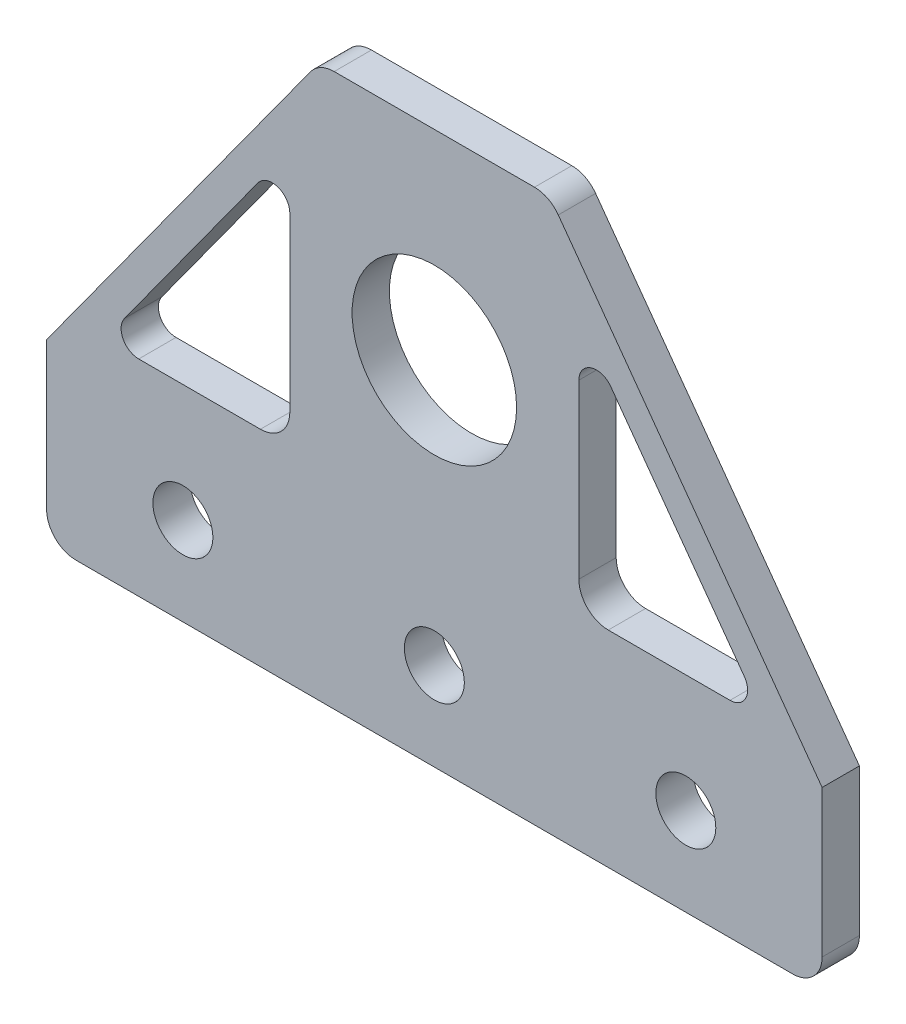
ISO-10303-21;
HEADER;
FILE_DESCRIPTION(('STEP AP214'),'2;1');
FILE_NAME('part.step','',(''),(''),'','','');
FILE_SCHEMA(('AUTOMOTIVE_DESIGN { 1 0 10303 214 1 1 1 1 }'));
ENDSEC;
DATA;
#1=APPLICATION_CONTEXT('core data for automotive mechanical design processes');
#2=APPLICATION_PROTOCOL_DEFINITION('international standard','automotive_design',2000,#1);
#3=PRODUCT_CONTEXT('',#1,'mechanical');
#4=PRODUCT('Part','Part','',(#3));
#5=PRODUCT_RELATED_PRODUCT_CATEGORY('part','',(#4));
#6=PRODUCT_DEFINITION_FORMATION('','',#4);
#7=PRODUCT_DEFINITION_CONTEXT('part definition',#1,'design');
#8=PRODUCT_DEFINITION('design','',#6,#7);
#9=PRODUCT_DEFINITION_SHAPE('','',#8);
#10=(LENGTH_UNIT() NAMED_UNIT(*) SI_UNIT(.MILLI.,.METRE.));
#11=(NAMED_UNIT(*) PLANE_ANGLE_UNIT() SI_UNIT($,.RADIAN.));
#12=(NAMED_UNIT(*) SI_UNIT($,.STERADIAN.) SOLID_ANGLE_UNIT());
#13=UNCERTAINTY_MEASURE_WITH_UNIT(LENGTH_MEASURE(1.E-05),#10,'distance_accuracy_value','');
#14=(GEOMETRIC_REPRESENTATION_CONTEXT(3) GLOBAL_UNCERTAINTY_ASSIGNED_CONTEXT((#13)) GLOBAL_UNIT_ASSIGNED_CONTEXT((#10,
#11,#12)) REPRESENTATION_CONTEXT('',''));
#15=CARTESIAN_POINT('',(0.,0.,0.));
#16=DIRECTION('',(0.,0.,1.));
#17=DIRECTION('',(1.,0.,0.));
#18=AXIS2_PLACEMENT_3D('',#15,#16,#17);
#19=CARTESIAN_POINT('',(0.,9.9999999999998,3.175));
#20=DIRECTION('',(0.,-1.,0.));
#21=DIRECTION('',(1.,0.,0.));
#22=AXIS2_PLACEMENT_3D('',#19,#20,#21);
#23=PLANE('',#22);
#24=DIRECTION('',(-1.,0.,0.));
#25=VECTOR('',#24,1.);
#26=CARTESIAN_POINT('',(0.,9.9999999999998,0.));
#27=LINE('',#26,#25);
#28=CARTESIAN_POINT('',(30.5,9.9999999999998,0.));
#29=VERTEX_POINT('',#28);
#30=CARTESIAN_POINT('',(-30.5,9.9999999999998,0.));
#31=VERTEX_POINT('',#30);
#32=EDGE_CURVE('E235',#29,#31,#27,.T.);
#33=ORIENTED_EDGE('',*,*,#32,.F.);
#34=DIRECTION('',(0.,0.,1.));
#35=VECTOR('',#34,1.);
#36=CARTESIAN_POINT('',(30.5,9.9999999999998,3.175));
#37=LINE('',#36,#35);
#38=CARTESIAN_POINT('',(30.5,9.9999999999998,3.175));
#39=VERTEX_POINT('',#38);
#40=EDGE_CURVE('E487',#29,#39,#37,.T.);
#41=ORIENTED_EDGE('',*,*,#40,.T.);
#42=DIRECTION('',(-1.,0.,0.));
#43=VECTOR('',#42,1.);
#44=CARTESIAN_POINT('',(0.,9.9999999999998,3.175));
#45=LINE('',#44,#43);
#46=CARTESIAN_POINT('',(-30.5,9.9999999999998,3.175));
#47=VERTEX_POINT('',#46);
#48=EDGE_CURVE('E246',#39,#47,#45,.T.);
#49=ORIENTED_EDGE('',*,*,#48,.T.);
#50=DIRECTION('',(0.,0.,1.));
#51=VECTOR('',#50,1.);
#52=CARTESIAN_POINT('',(-30.5,9.9999999999998,3.175));
#53=LINE('',#52,#51);
#54=EDGE_CURVE('E484',#47,#31,#53,.F.);
#55=ORIENTED_EDGE('',*,*,#54,.T.);
#56=EDGE_LOOP('',(#33,#41,#49,#55));
#57=FACE_BOUND('',#56,.T.);
#58=ADVANCED_FACE('F50',(#57),#23,.T.);
#59=CARTESIAN_POINT('',(0.,56.9999999999998,3.175));
#60=DIRECTION('',(0.,-1.,0.));
#61=DIRECTION('',(0.,0.,-1.));
#62=AXIS2_PLACEMENT_3D('',#59,#60,#61);
#63=PLANE('',#62);
#64=DIRECTION('',(-1.,0.,0.));
#65=VECTOR('',#64,1.);
#66=CARTESIAN_POINT('',(0.,56.9999999999998,3.175));
#67=LINE('',#66,#65);
#68=CARTESIAN_POINT('',(8.52459516824111,56.9999999999998,3.175));
#69=VERTEX_POINT('',#68);
#70=CARTESIAN_POINT('',(-8.52459516824109,56.9999999999998,3.175));
#71=VERTEX_POINT('',#70);
#72=EDGE_CURVE('E251',#69,#71,#67,.T.);
#73=ORIENTED_EDGE('',*,*,#72,.F.);
#74=DIRECTION('',(0.,0.,-1.));
#75=VECTOR('',#74,1.);
#76=CARTESIAN_POINT('',(8.52459516824111,56.9999999999998,0.));
#77=LINE('',#76,#75);
#78=CARTESIAN_POINT('',(8.52459516824111,56.9999999999998,0.));
#79=VERTEX_POINT('',#78);
#80=EDGE_CURVE('E521',#69,#79,#77,.T.);
#81=ORIENTED_EDGE('',*,*,#80,.T.);
#82=DIRECTION('',(-1.,0.,0.));
#83=VECTOR('',#82,1.);
#84=CARTESIAN_POINT('',(0.,56.9999999999998,0.));
#85=LINE('',#84,#83);
#86=CARTESIAN_POINT('',(-8.52459516824109,56.9999999999998,0.));
#87=VERTEX_POINT('',#86);
#88=EDGE_CURVE('E275',#79,#87,#85,.T.);
#89=ORIENTED_EDGE('',*,*,#88,.T.);
#90=DIRECTION('',(0.,0.,-1.));
#91=VECTOR('',#90,1.);
#92=CARTESIAN_POINT('',(-8.52459516824109,56.9999999999998,3.175));
#93=LINE('',#92,#91);
#94=EDGE_CURVE('E518',#87,#71,#93,.F.);
#95=ORIENTED_EDGE('',*,*,#94,.T.);
#96=EDGE_LOOP('',(#73,#81,#89,#95));
#97=FACE_BOUND('',#96,.T.);
#98=ADVANCED_FACE('F535',(#97),#63,.F.);
#99=CARTESIAN_POINT('',(0.,40.,3.175));
#100=DIRECTION('',(0.,0.,-1.));
#101=DIRECTION('',(-1.,0.,0.));
#102=AXIS2_PLACEMENT_3D('',#99,#100,#101);
#103=CYLINDRICAL_SURFACE('',#102,6.99999999999981);
#104=CARTESIAN_POINT('',(0.,40.,3.175));
#105=DIRECTION('',(0.,0.,1.));
#106=DIRECTION('',(1.,0.,0.));
#107=AXIS2_PLACEMENT_3D('',#104,#105,#106);
#108=CIRCLE('',#107,6.99999999999981);
#109=CARTESIAN_POINT('',(6.99999999999981,40.,3.175));
#110=VERTEX_POINT('',#109);
#111=EDGE_CURVE('E242',#110,#110,#108,.T.);
#112=ORIENTED_EDGE('',*,*,#111,.T.);
#113=EDGE_LOOP('',(#112));
#114=FACE_BOUND('',#113,.T.);
#115=CARTESIAN_POINT('',(0.,40.,0.));
#116=DIRECTION('',(0.,0.,1.));
#117=DIRECTION('',(1.,0.,0.));
#118=AXIS2_PLACEMENT_3D('',#115,#116,#117);
#119=CIRCLE('',#118,6.99999999999981);
#120=CARTESIAN_POINT('',(6.99999999999981,40.,0.));
#121=VERTEX_POINT('',#120);
#122=EDGE_CURVE('E230',#121,#121,#119,.T.);
#123=ORIENTED_EDGE('',*,*,#122,.F.);
#124=EDGE_LOOP('',(#123));
#125=FACE_BOUND('',#124,.T.);
#126=ADVANCED_FACE('F621',(#114,#125),#103,.F.);
#127=CARTESIAN_POINT('',(0.,17.5,3.175));
#128=DIRECTION('',(0.,0.,-1.));
#129=DIRECTION('',(-1.,0.,0.));
#130=AXIS2_PLACEMENT_3D('',#127,#128,#129);
#131=CYLINDRICAL_SURFACE('',#130,2.55269999999999);
#132=CARTESIAN_POINT('',(0.,17.5,3.175));
#133=DIRECTION('',(0.,0.,1.));
#134=DIRECTION('',(1.,0.,0.));
#135=AXIS2_PLACEMENT_3D('',#132,#133,#134);
#136=CIRCLE('',#135,2.55269999999999);
#137=CARTESIAN_POINT('',(2.5527,17.5,3.175));
#138=VERTEX_POINT('',#137);
#139=EDGE_CURVE('E255',#138,#138,#136,.T.);
#140=ORIENTED_EDGE('',*,*,#139,.T.);
#141=EDGE_LOOP('',(#140));
#142=FACE_BOUND('',#141,.T.);
#143=CARTESIAN_POINT('',(0.,17.5,0.));
#144=DIRECTION('',(0.,0.,1.));
#145=DIRECTION('',(1.,0.,0.));
#146=AXIS2_PLACEMENT_3D('',#143,#144,#145);
#147=CIRCLE('',#146,2.55269999999999);
#148=CARTESIAN_POINT('',(2.5527,17.5,0.));
#149=VERTEX_POINT('',#148);
#150=EDGE_CURVE('E247',#149,#149,#147,.T.);
#151=ORIENTED_EDGE('',*,*,#150,.F.);
#152=EDGE_LOOP('',(#151));
#153=FACE_BOUND('',#152,.T.);
#154=ADVANCED_FACE('F627',(#142,#153),#131,.F.);
#155=CARTESIAN_POINT('',(0.,0.,3.175));
#156=DIRECTION('',(0.,0.,1.));
#157=DIRECTION('',(1.,0.,0.));
#158=AXIS2_PLACEMENT_3D('',#155,#156,#157);
#159=PLANE('',#158);
#160=ORIENTED_EDGE('',*,*,#48,.F.);
#161=CARTESIAN_POINT('',(30.5,12.4999999999998,3.175));
#162=DIRECTION('',(0.,0.,1.));
#163=DIRECTION('',(1.,0.,0.));
#164=AXIS2_PLACEMENT_3D('',#161,#162,#163);
#165=CIRCLE('',#164,2.5);
#166=CARTESIAN_POINT('',(33.,12.4999999999998,3.175));
#167=VERTEX_POINT('',#166);
#168=EDGE_CURVE('E500',#39,#167,#165,.T.);
#169=ORIENTED_EDGE('',*,*,#168,.T.);
#170=DIRECTION('',(0.,1.,0.));
#171=VECTOR('',#170,1.);
#172=CARTESIAN_POINT('',(33.,0.,3.175));
#173=LINE('',#172,#171);
#174=CARTESIAN_POINT('',(33.,25.,3.175));
#175=VERTEX_POINT('',#174);
#176=EDGE_CURVE('E223',#167,#175,#173,.T.);
#177=ORIENTED_EDGE('',*,*,#176,.T.);
#178=DIRECTION('',(0.586967571460934,-0.809610443394385,0.));
#179=VECTOR('',#178,1.);
#180=CARTESIAN_POINT('',(33.5108562064727,24.2953707496929,3.175));
#181=LINE('',#180,#179);
#182=CARTESIAN_POINT('',(10.5486212767271,55.9674189286521,3.175));
#183=VERTEX_POINT('',#182);
#184=EDGE_CURVE('E213',#183,#175,#181,.T.);
#185=ORIENTED_EDGE('',*,*,#184,.F.);
#186=CARTESIAN_POINT('',(8.52459516824111,54.4999999999998,3.175));
#187=DIRECTION('',(0.,0.,1.));
#188=DIRECTION('',(1.,0.,0.));
#189=AXIS2_PLACEMENT_3D('',#186,#187,#188);
#190=CIRCLE('',#189,2.5);
#191=EDGE_CURVE('E494',#183,#69,#190,.T.);
#192=ORIENTED_EDGE('',*,*,#191,.T.);
#193=ORIENTED_EDGE('',*,*,#72,.T.);
#194=CARTESIAN_POINT('',(-8.52459516824109,54.4999999999998,3.175));
#195=DIRECTION('',(0.,0.,1.));
#196=DIRECTION('',(1.,0.,0.));
#197=AXIS2_PLACEMENT_3D('',#194,#195,#196);
#198=CIRCLE('',#197,2.5);
#199=CARTESIAN_POINT('',(-10.548621276727,55.9674189286521,3.175));
#200=VERTEX_POINT('',#199);
#201=EDGE_CURVE('E491',#71,#200,#198,.T.);
#202=ORIENTED_EDGE('',*,*,#201,.T.);
#203=DIRECTION('',(0.586967571460933,0.809610443394386,0.));
#204=VECTOR('',#203,1.);
#205=CARTESIAN_POINT('',(-33.5108562064727,24.2953707496928,3.175));
#206=LINE('',#205,#204);
#207=CARTESIAN_POINT('',(-33.,25.,3.175));
#208=VERTEX_POINT('',#207);
#209=EDGE_CURVE('E463',#208,#200,#206,.T.);
#210=ORIENTED_EDGE('',*,*,#209,.F.);
#211=DIRECTION('',(0.,-1.,0.));
#212=VECTOR('',#211,1.);
#213=CARTESIAN_POINT('',(-33.,0.,3.175));
#214=LINE('',#213,#212);
#215=CARTESIAN_POINT('',(-33.,12.4999999999998,3.175));
#216=VERTEX_POINT('',#215);
#217=EDGE_CURVE('E413',#208,#216,#214,.T.);
#218=ORIENTED_EDGE('',*,*,#217,.T.);
#219=CARTESIAN_POINT('',(-30.5,12.4999999999998,3.175));
#220=DIRECTION('',(0.,0.,1.));
#221=DIRECTION('',(1.,0.,0.));
#222=AXIS2_PLACEMENT_3D('',#219,#220,#221);
#223=CIRCLE('',#222,2.5);
#224=EDGE_CURVE('E497',#216,#47,#223,.T.);
#225=ORIENTED_EDGE('',*,*,#224,.T.);
#226=EDGE_LOOP('',(#160,#169,#177,#185,#192,#193,#202,#210,#218,#225));
#227=FACE_BOUND('',#226,.T.);
#228=ORIENTED_EDGE('',*,*,#111,.F.);
#229=EDGE_LOOP('',(#228));
#230=FACE_BOUND('',#229,.T.);
#231=ORIENTED_EDGE('',*,*,#139,.F.);
#232=EDGE_LOOP('',(#231));
#233=FACE_BOUND('',#232,.T.);
#234=CARTESIAN_POINT('',(21.4,17.5,3.175));
#235=DIRECTION('',(0.,0.,1.));
#236=DIRECTION('',(1.,0.,0.));
#237=AXIS2_PLACEMENT_3D('',#234,#235,#236);
#238=CIRCLE('',#237,2.55270000000003);
#239=CARTESIAN_POINT('',(23.9527,17.5,3.175));
#240=VERTEX_POINT('',#239);
#241=EDGE_CURVE('E224',#240,#240,#238,.T.);
#242=ORIENTED_EDGE('',*,*,#241,.F.);
#243=EDGE_LOOP('',(#242));
#244=FACE_BOUND('',#243,.T.);
#245=CARTESIAN_POINT('',(-21.4,17.5,3.175));
#246=DIRECTION('',(0.,0.,1.));
#247=DIRECTION('',(1.,0.,0.));
#248=AXIS2_PLACEMENT_3D('',#245,#246,#247);
#249=CIRCLE('',#248,2.55270000000003);
#250=CARTESIAN_POINT('',(-18.8473,17.5,3.175));
#251=VERTEX_POINT('',#250);
#252=EDGE_CURVE('E419',#251,#251,#249,.T.);
#253=ORIENTED_EDGE('',*,*,#252,.F.);
#254=EDGE_LOOP('',(#253));
#255=FACE_BOUND('',#254,.T.);
#256=DIRECTION('',(1.,0.,0.));
#257=VECTOR('',#256,1.);
#258=CARTESIAN_POINT('',(0.,27.5,3.175));
#259=LINE('',#258,#257);
#260=CARTESIAN_POINT('',(-25.1593522691857,27.5,3.175));
#261=VERTEX_POINT('',#260);
#262=CARTESIAN_POINT('',(-14.8,27.5,3.175));
#263=VERTEX_POINT('',#262);
#264=EDGE_CURVE('E405',#261,#263,#259,.T.);
#265=ORIENTED_EDGE('',*,*,#264,.F.);
#266=CARTESIAN_POINT('',(-25.1593522691857,29.,3.175));
#267=DIRECTION('',(0.,0.,1.));
#268=DIRECTION('',(1.,0.,0.));
#269=AXIS2_PLACEMENT_3D('',#266,#267,#268);
#270=CIRCLE('',#269,1.5);
#271=CARTESIAN_POINT('',(-26.3737679342773,29.8804513571914,3.175));
#272=VERTEX_POINT('',#271);
#273=EDGE_CURVE('E481',#261,#272,#270,.F.);
#274=ORIENTED_EDGE('',*,*,#273,.T.);
#275=DIRECTION('',(0.586967571460934,0.809610443394385,0.));
#276=VECTOR('',#275,1.);
#277=CARTESIAN_POINT('',(-31.4868300979867,22.8279518210405,3.175));
#278=LINE('',#277,#276);
#279=CARTESIAN_POINT('',(-15.0144156650916,45.5485234526199,3.175));
#280=VERTEX_POINT('',#279);
#281=EDGE_CURVE('E554',#272,#280,#278,.T.);
#282=ORIENTED_EDGE('',*,*,#281,.T.);
#283=CARTESIAN_POINT('',(-13.8,44.6680720954285,3.175));
#284=DIRECTION('',(0.,0.,1.));
#285=DIRECTION('',(1.,0.,0.));
#286=AXIS2_PLACEMENT_3D('',#283,#284,#285);
#287=CIRCLE('',#286,1.5);
#288=CARTESIAN_POINT('',(-12.3,44.6680720954285,3.175));
#289=VERTEX_POINT('',#288);
#290=EDGE_CURVE('E476',#280,#289,#287,.F.);
#291=ORIENTED_EDGE('',*,*,#290,.T.);
#292=DIRECTION('',(0.,1.,0.));
#293=VECTOR('',#292,1.);
#294=CARTESIAN_POINT('',(-12.3,0.,3.175));
#295=LINE('',#294,#293);
#296=CARTESIAN_POINT('',(-12.3,30.,3.175));
#297=VERTEX_POINT('',#296);
#298=EDGE_CURVE('E337',#297,#289,#295,.T.);
#299=ORIENTED_EDGE('',*,*,#298,.F.);
#300=CARTESIAN_POINT('',(-14.8,30.,3.175));
#301=DIRECTION('',(0.,0.,1.));
#302=DIRECTION('',(1.,0.,0.));
#303=AXIS2_PLACEMENT_3D('',#300,#301,#302);
#304=CIRCLE('',#303,2.5);
#305=EDGE_CURVE('E394',#297,#263,#304,.F.);
#306=ORIENTED_EDGE('',*,*,#305,.T.);
#307=EDGE_LOOP('',(#265,#274,#282,#291,#299,#306));
#308=FACE_BOUND('',#307,.T.);
#309=DIRECTION('',(0.,-1.,0.));
#310=VECTOR('',#309,1.);
#311=CARTESIAN_POINT('',(12.3,0.,3.175));
#312=LINE('',#311,#310);
#313=CARTESIAN_POINT('',(12.3,44.6680720954285,3.175));
#314=VERTEX_POINT('',#313);
#315=CARTESIAN_POINT('',(12.3,30.,3.175));
#316=VERTEX_POINT('',#315);
#317=EDGE_CURVE('E331',#314,#316,#312,.T.);
#318=ORIENTED_EDGE('',*,*,#317,.F.);
#319=CARTESIAN_POINT('',(13.8,44.6680720954285,3.175));
#320=DIRECTION('',(0.,0.,1.));
#321=DIRECTION('',(1.,0.,0.));
#322=AXIS2_PLACEMENT_3D('',#319,#320,#321);
#323=CIRCLE('',#322,1.5);
#324=CARTESIAN_POINT('',(15.0144156650916,45.5485234526199,3.175));
#325=VERTEX_POINT('',#324);
#326=EDGE_CURVE('E477',#314,#325,#323,.F.);
#327=ORIENTED_EDGE('',*,*,#326,.T.);
#328=DIRECTION('',(0.586967571460934,-0.809610443394385,0.));
#329=VECTOR('',#328,1.);
#330=CARTESIAN_POINT('',(31.4868300979867,22.8279518210405,3.175));
#331=LINE('',#330,#329);
#332=CARTESIAN_POINT('',(26.3737679342773,29.8804513571914,3.175));
#333=VERTEX_POINT('',#332);
#334=EDGE_CURVE('E352',#325,#333,#331,.T.);
#335=ORIENTED_EDGE('',*,*,#334,.T.);
#336=CARTESIAN_POINT('',(25.1593522691857,29.,3.175));
#337=DIRECTION('',(0.,0.,1.));
#338=DIRECTION('',(1.,0.,0.));
#339=AXIS2_PLACEMENT_3D('',#336,#337,#338);
#340=CIRCLE('',#339,1.5);
#341=CARTESIAN_POINT('',(25.1593522691857,27.5,3.175));
#342=VERTEX_POINT('',#341);
#343=EDGE_CURVE('E318',#333,#342,#340,.F.);
#344=ORIENTED_EDGE('',*,*,#343,.T.);
#345=DIRECTION('',(1.,0.,0.));
#346=VECTOR('',#345,1.);
#347=CARTESIAN_POINT('',(0.,27.5,3.175));
#348=LINE('',#347,#346);
#349=CARTESIAN_POINT('',(14.8,27.5,3.175));
#350=VERTEX_POINT('',#349);
#351=EDGE_CURVE('E348',#350,#342,#348,.T.);
#352=ORIENTED_EDGE('',*,*,#351,.F.);
#353=CARTESIAN_POINT('',(14.8,30.,3.175));
#354=DIRECTION('',(0.,0.,1.));
#355=DIRECTION('',(1.,0.,0.));
#356=AXIS2_PLACEMENT_3D('',#353,#354,#355);
#357=CIRCLE('',#356,2.5);
#358=EDGE_CURVE('E381',#350,#316,#357,.F.);
#359=ORIENTED_EDGE('',*,*,#358,.T.);
#360=EDGE_LOOP('',(#318,#327,#335,#344,#352,#359));
#361=FACE_BOUND('',#360,.T.);
#362=ADVANCED_FACE('F389',(#227,#230,#233,#244,#255,#308,#361),#159,.T.);
#363=CARTESIAN_POINT('',(0.,0.,0.));
#364=DIRECTION('',(0.,0.,1.));
#365=DIRECTION('',(1.,0.,0.));
#366=AXIS2_PLACEMENT_3D('',#363,#364,#365);
#367=PLANE('',#366);
#368=DIRECTION('',(0.,-1.,0.));
#369=VECTOR('',#368,1.);
#370=CARTESIAN_POINT('',(33.,0.,0.));
#371=LINE('',#370,#369);
#372=CARTESIAN_POINT('',(33.,25.,0.));
#373=VERTEX_POINT('',#372);
#374=CARTESIAN_POINT('',(33.,12.4999999999998,0.));
#375=VERTEX_POINT('',#374);
#376=EDGE_CURVE('E205',#373,#375,#371,.T.);
#377=ORIENTED_EDGE('',*,*,#376,.T.);
#378=CARTESIAN_POINT('',(30.5,12.4999999999998,0.));
#379=DIRECTION('',(0.,0.,1.));
#380=DIRECTION('',(1.,0.,0.));
#381=AXIS2_PLACEMENT_3D('',#378,#379,#380);
#382=CIRCLE('',#381,2.5);
#383=EDGE_CURVE('E511',#375,#29,#382,.F.);
#384=ORIENTED_EDGE('',*,*,#383,.T.);
#385=ORIENTED_EDGE('',*,*,#32,.T.);
#386=CARTESIAN_POINT('',(-30.5,12.4999999999998,0.));
#387=DIRECTION('',(0.,0.,1.));
#388=DIRECTION('',(1.,0.,0.));
#389=AXIS2_PLACEMENT_3D('',#386,#387,#388);
#390=CIRCLE('',#389,2.5);
#391=CARTESIAN_POINT('',(-33.,12.4999999999998,0.));
#392=VERTEX_POINT('',#391);
#393=EDGE_CURVE('E73',#31,#392,#390,.F.);
#394=ORIENTED_EDGE('',*,*,#393,.T.);
#395=DIRECTION('',(0.,1.,0.));
#396=VECTOR('',#395,1.);
#397=CARTESIAN_POINT('',(-33.,0.,0.));
#398=LINE('',#397,#396);
#399=CARTESIAN_POINT('',(-33.,25.,0.));
#400=VERTEX_POINT('',#399);
#401=EDGE_CURVE('E417',#392,#400,#398,.T.);
#402=ORIENTED_EDGE('',*,*,#401,.T.);
#403=DIRECTION('',(0.586967571460933,0.809610443394386,0.));
#404=VECTOR('',#403,1.);
#405=CARTESIAN_POINT('',(-33.5108562064727,24.2953707496928,0.));
#406=LINE('',#405,#404);
#407=CARTESIAN_POINT('',(-10.5486212767271,55.9674189286521,0.));
#408=VERTEX_POINT('',#407);
#409=EDGE_CURVE('E455',#400,#408,#406,.T.);
#410=ORIENTED_EDGE('',*,*,#409,.T.);
#411=CARTESIAN_POINT('',(-8.52459516824109,54.4999999999998,0.));
#412=DIRECTION('',(0.,0.,1.));
#413=DIRECTION('',(1.,0.,0.));
#414=AXIS2_PLACEMENT_3D('',#411,#412,#413);
#415=CIRCLE('',#414,2.5);
#416=EDGE_CURVE('E66',#408,#87,#415,.F.);
#417=ORIENTED_EDGE('',*,*,#416,.T.);
#418=ORIENTED_EDGE('',*,*,#88,.F.);
#419=CARTESIAN_POINT('',(8.52459516824111,54.4999999999998,0.));
#420=DIRECTION('',(0.,0.,1.));
#421=DIRECTION('',(1.,0.,0.));
#422=AXIS2_PLACEMENT_3D('',#419,#420,#421);
#423=CIRCLE('',#422,2.5);
#424=CARTESIAN_POINT('',(10.5486212767271,55.9674189286521,0.));
#425=VERTEX_POINT('',#424);
#426=EDGE_CURVE('E208',#79,#425,#423,.F.);
#427=ORIENTED_EDGE('',*,*,#426,.T.);
#428=DIRECTION('',(0.586967571460934,-0.809610443394385,0.));
#429=VECTOR('',#428,1.);
#430=CARTESIAN_POINT('',(33.5108562064727,24.2953707496929,0.));
#431=LINE('',#430,#429);
#432=EDGE_CURVE('E200',#425,#373,#431,.T.);
#433=ORIENTED_EDGE('',*,*,#432,.T.);
#434=EDGE_LOOP('',(#377,#384,#385,#394,#402,#410,#417,#418,#427,#433));
#435=FACE_BOUND('',#434,.T.);
#436=ORIENTED_EDGE('',*,*,#122,.T.);
#437=EDGE_LOOP('',(#436));
#438=FACE_BOUND('',#437,.T.);
#439=ORIENTED_EDGE('',*,*,#150,.T.);
#440=EDGE_LOOP('',(#439));
#441=FACE_BOUND('',#440,.T.);
#442=CARTESIAN_POINT('',(21.4,17.5,0.));
#443=DIRECTION('',(0.,0.,1.));
#444=DIRECTION('',(1.,0.,0.));
#445=AXIS2_PLACEMENT_3D('',#442,#443,#444);
#446=CIRCLE('',#445,2.55270000000003);
#447=CARTESIAN_POINT('',(23.9527,17.5,0.));
#448=VERTEX_POINT('',#447);
#449=EDGE_CURVE('E239',#448,#448,#446,.F.);
#450=ORIENTED_EDGE('',*,*,#449,.F.);
#451=EDGE_LOOP('',(#450));
#452=FACE_BOUND('',#451,.T.);
#453=CARTESIAN_POINT('',(-21.4,17.5,0.));
#454=DIRECTION('',(0.,0.,1.));
#455=DIRECTION('',(1.,0.,0.));
#456=AXIS2_PLACEMENT_3D('',#453,#454,#455);
#457=CIRCLE('',#456,2.55270000000003);
#458=CARTESIAN_POINT('',(-18.8473,17.5,0.));
#459=VERTEX_POINT('',#458);
#460=EDGE_CURVE('E409',#459,#459,#457,.F.);
#461=ORIENTED_EDGE('',*,*,#460,.F.);
#462=EDGE_LOOP('',(#461));
#463=FACE_BOUND('',#462,.T.);
#464=DIRECTION('',(0.586967571460934,0.809610443394386,0.));
#465=VECTOR('',#464,1.);
#466=CARTESIAN_POINT('',(-31.4868300979867,22.8279518210405,0.));
#467=LINE('',#466,#465);
#468=CARTESIAN_POINT('',(-26.3737679342773,29.8804513571914,0.));
#469=VERTEX_POINT('',#468);
#470=CARTESIAN_POINT('',(-15.0144156650916,45.5485234526199,0.));
#471=VERTEX_POINT('',#470);
#472=EDGE_CURVE('E446',#469,#471,#467,.T.);
#473=ORIENTED_EDGE('',*,*,#472,.F.);
#474=CARTESIAN_POINT('',(-25.1593522691857,29.,0.));
#475=DIRECTION('',(0.,0.,1.));
#476=DIRECTION('',(1.,0.,0.));
#477=AXIS2_PLACEMENT_3D('',#474,#475,#476);
#478=CIRCLE('',#477,1.5);
#479=CARTESIAN_POINT('',(-25.1593522691857,27.5,0.));
#480=VERTEX_POINT('',#479);
#481=EDGE_CURVE('E447',#469,#480,#478,.T.);
#482=ORIENTED_EDGE('',*,*,#481,.T.);
#483=DIRECTION('',(1.,0.,0.));
#484=VECTOR('',#483,1.);
#485=CARTESIAN_POINT('',(0.,27.5,0.));
#486=LINE('',#485,#484);
#487=CARTESIAN_POINT('',(-14.8,27.5,0.));
#488=VERTEX_POINT('',#487);
#489=EDGE_CURVE('E454',#480,#488,#486,.T.);
#490=ORIENTED_EDGE('',*,*,#489,.T.);
#491=CARTESIAN_POINT('',(-14.8,30.,0.));
#492=DIRECTION('',(0.,0.,1.));
#493=DIRECTION('',(1.,0.,0.));
#494=AXIS2_PLACEMENT_3D('',#491,#492,#493);
#495=CIRCLE('',#494,2.5);
#496=CARTESIAN_POINT('',(-12.3,30.,0.));
#497=VERTEX_POINT('',#496);
#498=EDGE_CURVE('E391',#488,#497,#495,.T.);
#499=ORIENTED_EDGE('',*,*,#498,.T.);
#500=DIRECTION('',(0.,1.,0.));
#501=VECTOR('',#500,1.);
#502=CARTESIAN_POINT('',(-12.3,0.,0.));
#503=LINE('',#502,#501);
#504=CARTESIAN_POINT('',(-12.3,44.6680720954285,0.));
#505=VERTEX_POINT('',#504);
#506=EDGE_CURVE('E410',#497,#505,#503,.T.);
#507=ORIENTED_EDGE('',*,*,#506,.T.);
#508=CARTESIAN_POINT('',(-13.8,44.6680720954285,0.));
#509=DIRECTION('',(0.,0.,1.));
#510=DIRECTION('',(1.,0.,0.));
#511=AXIS2_PLACEMENT_3D('',#508,#509,#510);
#512=CIRCLE('',#511,1.5);
#513=EDGE_CURVE('E450',#505,#471,#512,.T.);
#514=ORIENTED_EDGE('',*,*,#513,.T.);
#515=EDGE_LOOP('',(#473,#482,#490,#499,#507,#514));
#516=FACE_BOUND('',#515,.T.);
#517=DIRECTION('',(0.586967571460934,-0.809610443394386,0.));
#518=VECTOR('',#517,1.);
#519=CARTESIAN_POINT('',(31.4868300979867,22.8279518210405,0.));
#520=LINE('',#519,#518);
#521=CARTESIAN_POINT('',(15.0144156650916,45.5485234526199,0.));
#522=VERTEX_POINT('',#521);
#523=CARTESIAN_POINT('',(26.3737679342773,29.8804513571914,0.));
#524=VERTEX_POINT('',#523);
#525=EDGE_CURVE('E212',#522,#524,#520,.T.);
#526=ORIENTED_EDGE('',*,*,#525,.F.);
#527=CARTESIAN_POINT('',(13.8,44.6680720954285,0.));
#528=DIRECTION('',(0.,0.,1.));
#529=DIRECTION('',(1.,0.,0.));
#530=AXIS2_PLACEMENT_3D('',#527,#528,#529);
#531=CIRCLE('',#530,1.5);
#532=CARTESIAN_POINT('',(12.3,44.6680720954285,0.));
#533=VERTEX_POINT('',#532);
#534=EDGE_CURVE('E373',#522,#533,#531,.T.);
#535=ORIENTED_EDGE('',*,*,#534,.T.);
#536=DIRECTION('',(0.,-1.,0.));
#537=VECTOR('',#536,1.);
#538=CARTESIAN_POINT('',(12.3,0.,0.));
#539=LINE('',#538,#537);
#540=CARTESIAN_POINT('',(12.3,30.,0.));
#541=VERTEX_POINT('',#540);
#542=EDGE_CURVE('E332',#533,#541,#539,.T.);
#543=ORIENTED_EDGE('',*,*,#542,.T.);
#544=CARTESIAN_POINT('',(14.8,30.,0.));
#545=DIRECTION('',(0.,0.,1.));
#546=DIRECTION('',(1.,0.,0.));
#547=AXIS2_PLACEMENT_3D('',#544,#545,#546);
#548=CIRCLE('',#547,2.5);
#549=CARTESIAN_POINT('',(14.8,27.5,0.));
#550=VERTEX_POINT('',#549);
#551=EDGE_CURVE('E371',#541,#550,#548,.T.);
#552=ORIENTED_EDGE('',*,*,#551,.T.);
#553=DIRECTION('',(1.,0.,0.));
#554=VECTOR('',#553,1.);
#555=CARTESIAN_POINT('',(0.,27.5,0.));
#556=LINE('',#555,#554);
#557=CARTESIAN_POINT('',(25.1593522691857,27.5,0.));
#558=VERTEX_POINT('',#557);
#559=EDGE_CURVE('E325',#550,#558,#556,.T.);
#560=ORIENTED_EDGE('',*,*,#559,.T.);
#561=CARTESIAN_POINT('',(25.1593522691857,29.,0.));
#562=DIRECTION('',(0.,0.,1.));
#563=DIRECTION('',(1.,0.,0.));
#564=AXIS2_PLACEMENT_3D('',#561,#562,#563);
#565=CIRCLE('',#564,1.5);
#566=EDGE_CURVE('E314',#558,#524,#565,.T.);
#567=ORIENTED_EDGE('',*,*,#566,.T.);
#568=EDGE_LOOP('',(#526,#535,#543,#552,#560,#567));
#569=FACE_BOUND('',#568,.T.);
#570=ADVANCED_FACE('F202',(#435,#438,#441,#452,#463,#516,#569),#367,.F.);
#571=CARTESIAN_POINT('',(21.4,17.5,-27.6267985839838));
#572=DIRECTION('',(0.,0.,1.));
#573=DIRECTION('',(1.,0.,0.));
#574=AXIS2_PLACEMENT_3D('',#571,#572,#573);
#575=CYLINDRICAL_SURFACE('',#574,2.55270000000003);
#576=CARTESIAN_POINT('',(23.9527,17.5,0.));
#577=CARTESIAN_POINT('',(23.9527,17.5,0.0330729166666671));
#578=CARTESIAN_POINT('',(23.9527,17.5,0.0661458333333342));
#579=CARTESIAN_POINT('',(23.9527,17.5,0.132291666666667));
#580=CARTESIAN_POINT('',(23.9527,17.5,0.165364583333333));
#581=CARTESIAN_POINT('',(23.9527,17.5,0.231510416666666));
#582=CARTESIAN_POINT('',(23.9527,17.5,0.264583333333333));
#583=CARTESIAN_POINT('',(23.9527,17.5,0.330729166666666));
#584=CARTESIAN_POINT('',(23.9527,17.5,0.363802083333332));
#585=CARTESIAN_POINT('',(23.9527,17.5,0.429947916666665));
#586=CARTESIAN_POINT('',(23.9527,17.5,0.463020833333332));
#587=CARTESIAN_POINT('',(23.9527,17.5,0.529166666666666));
#588=CARTESIAN_POINT('',(23.9527,17.5,0.562239583333333));
#589=CARTESIAN_POINT('',(23.9527,17.5,0.628385416666666));
#590=CARTESIAN_POINT('',(23.9527,17.5,0.661458333333332));
#591=CARTESIAN_POINT('',(23.9527,17.5,0.727604166666665));
#592=CARTESIAN_POINT('',(23.9527,17.5,0.760677083333332));
#593=CARTESIAN_POINT('',(23.9527,17.5,0.826822916666666));
#594=CARTESIAN_POINT('',(23.9527,17.5,0.859895833333334));
#595=CARTESIAN_POINT('',(23.9527,17.5,0.926041666666666));
#596=CARTESIAN_POINT('',(23.9527,17.5,0.959114583333332));
#597=CARTESIAN_POINT('',(23.9527,17.5,1.02526041666667));
#598=CARTESIAN_POINT('',(23.9527,17.5,1.05833333333333));
#599=CARTESIAN_POINT('',(23.9527,17.5,1.12447916666667));
#600=CARTESIAN_POINT('',(23.9527,17.5,1.15755208333333));
#601=CARTESIAN_POINT('',(23.9527,17.5,1.22369791666667));
#602=CARTESIAN_POINT('',(23.9527,17.5,1.25677083333333));
#603=CARTESIAN_POINT('',(23.9527,17.5,1.32291666666667));
#604=CARTESIAN_POINT('',(23.9527,17.5,1.35598958333333));
#605=CARTESIAN_POINT('',(23.9527,17.5,1.42213541666667));
#606=CARTESIAN_POINT('',(23.9527,17.5,1.45520833333333));
#607=CARTESIAN_POINT('',(23.9527,17.5,1.52135416666666));
#608=CARTESIAN_POINT('',(23.9527,17.5,1.55442708333333));
#609=CARTESIAN_POINT('',(23.9527,17.5,1.62057291666667));
#610=CARTESIAN_POINT('',(23.9527,17.5,1.65364583333333));
#611=CARTESIAN_POINT('',(23.9527,17.5,1.71979166666667));
#612=CARTESIAN_POINT('',(23.9527,17.5,1.75286458333333));
#613=CARTESIAN_POINT('',(23.9527,17.5,1.81901041666666));
#614=CARTESIAN_POINT('',(23.9527,17.5,1.85208333333333));
#615=CARTESIAN_POINT('',(23.9527,17.5,1.91822916666666));
#616=CARTESIAN_POINT('',(23.9527,17.5,1.95130208333333));
#617=CARTESIAN_POINT('',(23.9527,17.5,2.01744791666666));
#618=CARTESIAN_POINT('',(23.9527,17.5,2.05052083333333));
#619=CARTESIAN_POINT('',(23.9527,17.5,2.11666666666666));
#620=CARTESIAN_POINT('',(23.9527,17.5,2.14973958333333));
#621=CARTESIAN_POINT('',(23.9527,17.5,2.21588541666666));
#622=CARTESIAN_POINT('',(23.9527,17.5,2.24895833333333));
#623=CARTESIAN_POINT('',(23.9527,17.5,2.31510416666666));
#624=CARTESIAN_POINT('',(23.9527,17.5,2.34817708333333));
#625=CARTESIAN_POINT('',(23.9527,17.5,2.41432291666667));
#626=CARTESIAN_POINT('',(23.9527,17.5,2.44739583333333));
#627=CARTESIAN_POINT('',(23.9527,17.5,2.51354166666667));
#628=CARTESIAN_POINT('',(23.9527,17.5,2.54661458333333));
#629=CARTESIAN_POINT('',(23.9527,17.5,2.61276041666666));
#630=CARTESIAN_POINT('',(23.9527,17.5,2.64583333333333));
#631=CARTESIAN_POINT('',(23.9527,17.5,2.71197916666667));
#632=CARTESIAN_POINT('',(23.9527,17.5,2.74505208333333));
#633=CARTESIAN_POINT('',(23.9527,17.5,2.81119791666667));
#634=CARTESIAN_POINT('',(23.9527,17.5,2.84427083333333));
#635=CARTESIAN_POINT('',(23.9527,17.5,2.91041666666666));
#636=CARTESIAN_POINT('',(23.9527,17.5,2.94348958333333));
#637=CARTESIAN_POINT('',(23.9527,17.5,3.00963541666666));
#638=CARTESIAN_POINT('',(23.9527,17.5,3.04270833333333));
#639=CARTESIAN_POINT('',(23.9527,17.5,3.10885416666666));
#640=CARTESIAN_POINT('',(23.9527,17.5,3.14192708333333));
#641=CARTESIAN_POINT('',(23.9527,17.5,3.175));
#642=B_SPLINE_CURVE_WITH_KNOTS('',3,(#576,#577,#578,#579,#580,#581,#582,#583,#584,#585,#586,
#587,#588,#589,#590,#591,#592,#593,#594,#595,#596,#597,#598,#599,#600,#601,#602,#603,#604,#605,
#606,#607,#608,#609,#610,#611,#612,#613,#614,#615,#616,#617,#618,#619,#620,#621,#622,#623,#624,
#625,#626,#627,#628,#629,#630,#631,#632,#633,#634,#635,#636,#637,#638,#639,#640,#641),
.UNSPECIFIED.,.F.,.F.,(4,2,2,2,2,2,2,2,2,2,2,2,2,2,2,2,2,2,2,2,2,2,2,2,2,2,2,2,2,2,2,2,4),(0.,
0.0992187500000012,0.198437499999999,0.29765625,0.396874999999998,0.496093749999999,0.5953125,
0.694531249999998,0.793749999999999,0.892968750000001,0.992187499999998,1.09140625,1.190625,
1.28984375,1.3890625,1.48828125,1.5875,1.68671875,1.7859375,1.88515625,1.984375,2.08359375,
2.1828125,2.28203125,2.38125,2.48046875,2.5796875,2.67890625,2.778125,2.87734375,2.9765625,
3.07578125,3.175),.UNSPECIFIED.);
#643=EDGE_CURVE('BSEAM437',#448,#240,#642,.T.);
#644=ORIENTED_EDGE('',*,*,#449,.T.);
#645=ORIENTED_EDGE('',*,*,#241,.T.);
#646=ORIENTED_EDGE('',*,*,#643,.T.);
#647=ORIENTED_EDGE('',*,*,#643,.F.);
#648=EDGE_LOOP('',(#644,#646,#645,#647));
#649=FACE_BOUND('',#648,.T.);
#650=ADVANCED_FACE('F437',(#649),#575,.F.);
#651=CARTESIAN_POINT('',(33.,0.,-27.6267985839838));
#652=DIRECTION('',(1.,0.,0.));
#653=DIRECTION('',(0.,1.,0.));
#654=AXIS2_PLACEMENT_3D('',#651,#652,#653);
#655=PLANE('',#654);
#656=ORIENTED_EDGE('',*,*,#176,.F.);
#657=DIRECTION('',(0.,0.,1.));
#658=VECTOR('',#657,1.);
#659=CARTESIAN_POINT('',(33.,12.4999999999998,-27.6267985839838));
#660=LINE('',#659,#658);
#661=EDGE_CURVE('E228',#167,#375,#660,.F.);
#662=ORIENTED_EDGE('',*,*,#661,.T.);
#663=ORIENTED_EDGE('',*,*,#376,.F.);
#664=DIRECTION('',(0.,0.,1.));
#665=VECTOR('',#664,1.);
#666=CARTESIAN_POINT('',(33.,25.,-27.6267985839838));
#667=LINE('',#666,#665);
#668=EDGE_CURVE('E217',#373,#175,#667,.T.);
#669=ORIENTED_EDGE('',*,*,#668,.T.);
#670=EDGE_LOOP('',(#656,#662,#663,#669));
#671=FACE_BOUND('',#670,.T.);
#672=ADVANCED_FACE('F226',(#671),#655,.T.);
#673=CARTESIAN_POINT('',(-33.,0.,-27.6267985839838));
#674=DIRECTION('',(-1.,0.,0.));
#675=DIRECTION('',(0.,0.,1.));
#676=AXIS2_PLACEMENT_3D('',#673,#674,#675);
#677=PLANE('',#676);
#678=ORIENTED_EDGE('',*,*,#401,.F.);
#679=DIRECTION('',(0.,0.,1.));
#680=VECTOR('',#679,1.);
#681=CARTESIAN_POINT('',(-33.,12.4999999999998,-27.6267985839838));
#682=LINE('',#681,#680);
#683=EDGE_CURVE('E514',#392,#216,#682,.T.);
#684=ORIENTED_EDGE('',*,*,#683,.T.);
#685=ORIENTED_EDGE('',*,*,#217,.F.);
#686=DIRECTION('',(0.,0.,1.));
#687=VECTOR('',#686,1.);
#688=CARTESIAN_POINT('',(-33.,25.,-27.6267985839838));
#689=LINE('',#688,#687);
#690=EDGE_CURVE('E418',#400,#208,#689,.T.);
#691=ORIENTED_EDGE('',*,*,#690,.F.);
#692=EDGE_LOOP('',(#678,#684,#685,#691));
#693=FACE_BOUND('',#692,.T.);
#694=ADVANCED_FACE('F547',(#693),#677,.T.);
#695=CARTESIAN_POINT('',(-21.4,17.5,-27.6267985839838));
#696=DIRECTION('',(0.,0.,1.));
#697=DIRECTION('',(1.,0.,0.));
#698=AXIS2_PLACEMENT_3D('',#695,#696,#697);
#699=CYLINDRICAL_SURFACE('',#698,2.55270000000003);
#700=CARTESIAN_POINT('',(-18.8473,17.5,0.));
#701=CARTESIAN_POINT('',(-18.8473,17.5,0.0330729166666671));
#702=CARTESIAN_POINT('',(-18.8473,17.5,0.0661458333333342));
#703=CARTESIAN_POINT('',(-18.8473,17.5,0.132291666666667));
#704=CARTESIAN_POINT('',(-18.8473,17.5,0.165364583333333));
#705=CARTESIAN_POINT('',(-18.8473,17.5,0.231510416666666));
#706=CARTESIAN_POINT('',(-18.8473,17.5,0.264583333333333));
#707=CARTESIAN_POINT('',(-18.8473,17.5,0.330729166666666));
#708=CARTESIAN_POINT('',(-18.8473,17.5,0.363802083333332));
#709=CARTESIAN_POINT('',(-18.8473,17.5,0.429947916666665));
#710=CARTESIAN_POINT('',(-18.8473,17.5,0.463020833333332));
#711=CARTESIAN_POINT('',(-18.8473,17.5,0.529166666666666));
#712=CARTESIAN_POINT('',(-18.8473,17.5,0.562239583333333));
#713=CARTESIAN_POINT('',(-18.8473,17.5,0.628385416666666));
#714=CARTESIAN_POINT('',(-18.8473,17.5,0.661458333333332));
#715=CARTESIAN_POINT('',(-18.8473,17.5,0.727604166666665));
#716=CARTESIAN_POINT('',(-18.8473,17.5,0.760677083333332));
#717=CARTESIAN_POINT('',(-18.8473,17.5,0.826822916666666));
#718=CARTESIAN_POINT('',(-18.8473,17.5,0.859895833333334));
#719=CARTESIAN_POINT('',(-18.8473,17.5,0.926041666666666));
#720=CARTESIAN_POINT('',(-18.8473,17.5,0.959114583333332));
#721=CARTESIAN_POINT('',(-18.8473,17.5,1.02526041666667));
#722=CARTESIAN_POINT('',(-18.8473,17.5,1.05833333333333));
#723=CARTESIAN_POINT('',(-18.8473,17.5,1.12447916666667));
#724=CARTESIAN_POINT('',(-18.8473,17.5,1.15755208333333));
#725=CARTESIAN_POINT('',(-18.8473,17.5,1.22369791666667));
#726=CARTESIAN_POINT('',(-18.8473,17.5,1.25677083333333));
#727=CARTESIAN_POINT('',(-18.8473,17.5,1.32291666666667));
#728=CARTESIAN_POINT('',(-18.8473,17.5,1.35598958333333));
#729=CARTESIAN_POINT('',(-18.8473,17.5,1.42213541666667));
#730=CARTESIAN_POINT('',(-18.8473,17.5,1.45520833333333));
#731=CARTESIAN_POINT('',(-18.8473,17.5,1.52135416666666));
#732=CARTESIAN_POINT('',(-18.8473,17.5,1.55442708333333));
#733=CARTESIAN_POINT('',(-18.8473,17.5,1.62057291666667));
#734=CARTESIAN_POINT('',(-18.8473,17.5,1.65364583333333));
#735=CARTESIAN_POINT('',(-18.8473,17.5,1.71979166666667));
#736=CARTESIAN_POINT('',(-18.8473,17.5,1.75286458333333));
#737=CARTESIAN_POINT('',(-18.8473,17.5,1.81901041666666));
#738=CARTESIAN_POINT('',(-18.8473,17.5,1.85208333333333));
#739=CARTESIAN_POINT('',(-18.8473,17.5,1.91822916666666));
#740=CARTESIAN_POINT('',(-18.8473,17.5,1.95130208333333));
#741=CARTESIAN_POINT('',(-18.8473,17.5,2.01744791666666));
#742=CARTESIAN_POINT('',(-18.8473,17.5,2.05052083333333));
#743=CARTESIAN_POINT('',(-18.8473,17.5,2.11666666666666));
#744=CARTESIAN_POINT('',(-18.8473,17.5,2.14973958333333));
#745=CARTESIAN_POINT('',(-18.8473,17.5,2.21588541666666));
#746=CARTESIAN_POINT('',(-18.8473,17.5,2.24895833333333));
#747=CARTESIAN_POINT('',(-18.8473,17.5,2.31510416666666));
#748=CARTESIAN_POINT('',(-18.8473,17.5,2.34817708333333));
#749=CARTESIAN_POINT('',(-18.8473,17.5,2.41432291666667));
#750=CARTESIAN_POINT('',(-18.8473,17.5,2.44739583333333));
#751=CARTESIAN_POINT('',(-18.8473,17.5,2.51354166666667));
#752=CARTESIAN_POINT('',(-18.8473,17.5,2.54661458333333));
#753=CARTESIAN_POINT('',(-18.8473,17.5,2.61276041666666));
#754=CARTESIAN_POINT('',(-18.8473,17.5,2.64583333333333));
#755=CARTESIAN_POINT('',(-18.8473,17.5,2.71197916666667));
#756=CARTESIAN_POINT('',(-18.8473,17.5,2.74505208333333));
#757=CARTESIAN_POINT('',(-18.8473,17.5,2.81119791666667));
#758=CARTESIAN_POINT('',(-18.8473,17.5,2.84427083333333));
#759=CARTESIAN_POINT('',(-18.8473,17.5,2.91041666666666));
#760=CARTESIAN_POINT('',(-18.8473,17.5,2.94348958333333));
#761=CARTESIAN_POINT('',(-18.8473,17.5,3.00963541666666));
#762=CARTESIAN_POINT('',(-18.8473,17.5,3.04270833333333));
#763=CARTESIAN_POINT('',(-18.8473,17.5,3.10885416666666));
#764=CARTESIAN_POINT('',(-18.8473,17.5,3.14192708333333));
#765=CARTESIAN_POINT('',(-18.8473,17.5,3.175));
#766=B_SPLINE_CURVE_WITH_KNOTS('',3,(#700,#701,#702,#703,#704,#705,#706,#707,#708,#709,#710,
#711,#712,#713,#714,#715,#716,#717,#718,#719,#720,#721,#722,#723,#724,#725,#726,#727,#728,#729,
#730,#731,#732,#733,#734,#735,#736,#737,#738,#739,#740,#741,#742,#743,#744,#745,#746,#747,#748,
#749,#750,#751,#752,#753,#754,#755,#756,#757,#758,#759,#760,#761,#762,#763,#764,#765),
.UNSPECIFIED.,.F.,.F.,(4,2,2,2,2,2,2,2,2,2,2,2,2,2,2,2,2,2,2,2,2,2,2,2,2,2,2,2,2,2,2,2,4),(0.,
0.0992187500000012,0.198437499999999,0.29765625,0.396874999999998,0.496093749999999,0.5953125,
0.694531249999998,0.793749999999999,0.892968750000001,0.992187499999998,1.09140625,1.190625,
1.28984375,1.3890625,1.48828125,1.5875,1.68671875,1.7859375,1.88515625,1.984375,2.08359375,
2.1828125,2.28203125,2.38125,2.48046875,2.5796875,2.67890625,2.778125,2.87734375,2.9765625,
3.07578125,3.175),.UNSPECIFIED.);
#767=EDGE_CURVE('BSEAM785',#459,#251,#766,.T.);
#768=ORIENTED_EDGE('',*,*,#460,.T.);
#769=ORIENTED_EDGE('',*,*,#252,.T.);
#770=ORIENTED_EDGE('',*,*,#767,.T.);
#771=ORIENTED_EDGE('',*,*,#767,.F.);
#772=EDGE_LOOP('',(#768,#770,#769,#771));
#773=FACE_BOUND('',#772,.T.);
#774=ADVANCED_FACE('F785',(#773),#699,.F.);
#775=CARTESIAN_POINT('',(-33.5108562064727,24.2953707496928,42.7001818465138));
#776=DIRECTION('',(-0.809610443394386,0.586967571460933,0.));
#777=DIRECTION('',(-0.586967571460933,-0.809610443394386,0.));
#778=AXIS2_PLACEMENT_3D('',#775,#776,#777);
#779=PLANE('',#778);
#780=ORIENTED_EDGE('',*,*,#209,.T.);
#781=DIRECTION('',(0.,0.,-1.));
#782=VECTOR('',#781,1.);
#783=CARTESIAN_POINT('',(-10.548621276727,55.9674189286521,0.));
#784=LINE('',#783,#782);
#785=EDGE_CURVE('E12',#200,#408,#784,.T.);
#786=ORIENTED_EDGE('',*,*,#785,.T.);
#787=ORIENTED_EDGE('',*,*,#409,.F.);
#788=ORIENTED_EDGE('',*,*,#690,.T.);
#789=EDGE_LOOP('',(#780,#786,#787,#788));
#790=FACE_BOUND('',#789,.T.);
#791=ADVANCED_FACE('F778',(#790),#779,.T.);
#792=CARTESIAN_POINT('',(0.,27.5,42.7001818465138));
#793=DIRECTION('',(0.,1.,0.));
#794=DIRECTION('',(-1.,0.,0.));
#795=AXIS2_PLACEMENT_3D('',#792,#793,#794);
#796=PLANE('',#795);
#797=ORIENTED_EDGE('',*,*,#489,.F.);
#798=DIRECTION('',(0.,0.,-1.));
#799=VECTOR('',#798,1.);
#800=CARTESIAN_POINT('',(-25.1593522691857,27.5,42.7001818465138));
#801=LINE('',#800,#799);
#802=EDGE_CURVE('E311',#480,#261,#801,.F.);
#803=ORIENTED_EDGE('',*,*,#802,.T.);
#804=ORIENTED_EDGE('',*,*,#264,.T.);
#805=DIRECTION('',(0.,0.,-1.));
#806=VECTOR('',#805,1.);
#807=CARTESIAN_POINT('',(-14.8,27.5,0.));
#808=LINE('',#807,#806);
#809=EDGE_CURVE('E587',#263,#488,#808,.T.);
#810=ORIENTED_EDGE('',*,*,#809,.T.);
#811=EDGE_LOOP('',(#797,#803,#804,#810));
#812=FACE_BOUND('',#811,.T.);
#813=ADVANCED_FACE('F582',(#812),#796,.T.);
#814=CARTESIAN_POINT('',(-12.3,0.,42.7001818465138));
#815=DIRECTION('',(-1.,0.,0.));
#816=DIRECTION('',(0.,-1.,0.));
#817=AXIS2_PLACEMENT_3D('',#814,#815,#816);
#818=PLANE('',#817);
#819=ORIENTED_EDGE('',*,*,#298,.T.);
#820=DIRECTION('',(0.,0.,-1.));
#821=VECTOR('',#820,1.);
#822=CARTESIAN_POINT('',(-12.3,44.6680720954285,42.7001818465138));
#823=LINE('',#822,#821);
#824=EDGE_CURVE('E298',#289,#505,#823,.T.);
#825=ORIENTED_EDGE('',*,*,#824,.T.);
#826=ORIENTED_EDGE('',*,*,#506,.F.);
#827=DIRECTION('',(0.,0.,-1.));
#828=VECTOR('',#827,1.);
#829=CARTESIAN_POINT('',(-12.3,30.,3.175));
#830=LINE('',#829,#828);
#831=EDGE_CURVE('E382',#497,#297,#830,.F.);
#832=ORIENTED_EDGE('',*,*,#831,.T.);
#833=EDGE_LOOP('',(#819,#825,#826,#832));
#834=FACE_BOUND('',#833,.T.);
#835=ADVANCED_FACE('F567',(#834),#818,.T.);
#836=CARTESIAN_POINT('',(-31.4868300979867,22.8279518210405,42.7001818465138));
#837=DIRECTION('',(-0.809610443394385,0.586967571460934,0.));
#838=DIRECTION('',(-0.586967571460934,-0.809610443394385,0.));
#839=AXIS2_PLACEMENT_3D('',#836,#837,#838);
#840=PLANE('',#839);
#841=ORIENTED_EDGE('',*,*,#472,.T.);
#842=DIRECTION('',(0.,0.,-1.));
#843=VECTOR('',#842,1.);
#844=CARTESIAN_POINT('',(-15.0144156650916,45.5485234526199,42.7001818465138));
#845=LINE('',#844,#843);
#846=EDGE_CURVE('E308',#471,#280,#845,.F.);
#847=ORIENTED_EDGE('',*,*,#846,.T.);
#848=ORIENTED_EDGE('',*,*,#281,.F.);
#849=DIRECTION('',(0.,0.,-1.));
#850=VECTOR('',#849,1.);
#851=CARTESIAN_POINT('',(-26.3737679342773,29.8804513571914,42.7001818465138));
#852=LINE('',#851,#850);
#853=EDGE_CURVE('E303',#272,#469,#852,.T.);
#854=ORIENTED_EDGE('',*,*,#853,.T.);
#855=EDGE_LOOP('',(#841,#847,#848,#854));
#856=FACE_BOUND('',#855,.T.);
#857=ADVANCED_FACE('F574',(#856),#840,.F.);
#858=CARTESIAN_POINT('',(33.5108562064727,24.2953707496929,42.7001818465138));
#859=DIRECTION('',(0.809610443394385,0.586967571460934,0.));
#860=DIRECTION('',(-0.586967571460934,0.809610443394385,0.));
#861=AXIS2_PLACEMENT_3D('',#858,#859,#860);
#862=PLANE('',#861);
#863=ORIENTED_EDGE('',*,*,#432,.F.);
#864=DIRECTION('',(0.,0.,-1.));
#865=VECTOR('',#864,1.);
#866=CARTESIAN_POINT('',(10.5486212767271,55.9674189286521,3.175));
#867=LINE('',#866,#865);
#868=EDGE_CURVE('E59',#425,#183,#867,.F.);
#869=ORIENTED_EDGE('',*,*,#868,.T.);
#870=ORIENTED_EDGE('',*,*,#184,.T.);
#871=ORIENTED_EDGE('',*,*,#668,.F.);
#872=EDGE_LOOP('',(#863,#869,#870,#871));
#873=FACE_BOUND('',#872,.T.);
#874=ADVANCED_FACE('F218',(#873),#862,.T.);
#875=CARTESIAN_POINT('',(12.3,0.,42.7001818465138));
#876=DIRECTION('',(1.,0.,0.));
#877=DIRECTION('',(0.,1.,0.));
#878=AXIS2_PLACEMENT_3D('',#875,#876,#877);
#879=PLANE('',#878);
#880=ORIENTED_EDGE('',*,*,#542,.F.);
#881=DIRECTION('',(0.,0.,-1.));
#882=VECTOR('',#881,1.);
#883=CARTESIAN_POINT('',(12.3,44.6680720954285,42.7001818465138));
#884=LINE('',#883,#882);
#885=EDGE_CURVE('E296',#533,#314,#884,.F.);
#886=ORIENTED_EDGE('',*,*,#885,.T.);
#887=ORIENTED_EDGE('',*,*,#317,.T.);
#888=DIRECTION('',(0.,0.,-1.));
#889=VECTOR('',#888,1.);
#890=CARTESIAN_POINT('',(12.3,30.,0.));
#891=LINE('',#890,#889);
#892=EDGE_CURVE('E258',#316,#541,#891,.T.);
#893=ORIENTED_EDGE('',*,*,#892,.T.);
#894=EDGE_LOOP('',(#880,#886,#887,#893));
#895=FACE_BOUND('',#894,.T.);
#896=ADVANCED_FACE('F383',(#895),#879,.T.);
#897=CARTESIAN_POINT('',(0.,27.5,42.7001818465138));
#898=DIRECTION('',(0.,1.,0.));
#899=DIRECTION('',(-1.,0.,0.));
#900=AXIS2_PLACEMENT_3D('',#897,#898,#899);
#901=PLANE('',#900);
#902=ORIENTED_EDGE('',*,*,#351,.T.);
#903=DIRECTION('',(0.,0.,-1.));
#904=VECTOR('',#903,1.);
#905=CARTESIAN_POINT('',(25.1593522691857,27.5,42.7001818465138));
#906=LINE('',#905,#904);
#907=EDGE_CURVE('E291',#342,#558,#906,.T.);
#908=ORIENTED_EDGE('',*,*,#907,.T.);
#909=ORIENTED_EDGE('',*,*,#559,.F.);
#910=DIRECTION('',(0.,0.,-1.));
#911=VECTOR('',#910,1.);
#912=CARTESIAN_POINT('',(14.8,27.5,3.175));
#913=LINE('',#912,#911);
#914=EDGE_CURVE('E280',#550,#350,#913,.F.);
#915=ORIENTED_EDGE('',*,*,#914,.T.);
#916=EDGE_LOOP('',(#902,#908,#909,#915));
#917=FACE_BOUND('',#916,.T.);
#918=ADVANCED_FACE('F594',(#917),#901,.T.);
#919=CARTESIAN_POINT('',(31.4868300979867,22.8279518210405,42.7001818465138));
#920=DIRECTION('',(0.809610443394385,0.586967571460934,0.));
#921=DIRECTION('',(-0.586967571460934,0.809610443394385,0.));
#922=AXIS2_PLACEMENT_3D('',#919,#920,#921);
#923=PLANE('',#922);
#924=ORIENTED_EDGE('',*,*,#525,.T.);
#925=DIRECTION('',(0.,0.,-1.));
#926=VECTOR('',#925,1.);
#927=CARTESIAN_POINT('',(26.3737679342773,29.8804513571914,42.7001818465138));
#928=LINE('',#927,#926);
#929=EDGE_CURVE('E290',#524,#333,#928,.F.);
#930=ORIENTED_EDGE('',*,*,#929,.T.);
#931=ORIENTED_EDGE('',*,*,#334,.F.);
#932=DIRECTION('',(0.,0.,-1.));
#933=VECTOR('',#932,1.);
#934=CARTESIAN_POINT('',(15.0144156650916,45.5485234526199,42.7001818465138));
#935=LINE('',#934,#933);
#936=EDGE_CURVE('E285',#325,#522,#935,.T.);
#937=ORIENTED_EDGE('',*,*,#936,.T.);
#938=EDGE_LOOP('',(#924,#930,#931,#937));
#939=FACE_BOUND('',#938,.T.);
#940=ADVANCED_FACE('F601',(#939),#923,.F.);
#941=CARTESIAN_POINT('',(14.8,30.,42.7001818465138));
#942=DIRECTION('',(0.,0.,1.));
#943=DIRECTION('',(1.,0.,0.));
#944=AXIS2_PLACEMENT_3D('',#941,#942,#943);
#945=CYLINDRICAL_SURFACE('',#944,2.5);
#946=ORIENTED_EDGE('',*,*,#358,.F.);
#947=ORIENTED_EDGE('',*,*,#914,.F.);
#948=ORIENTED_EDGE('',*,*,#551,.F.);
#949=ORIENTED_EDGE('',*,*,#892,.F.);
#950=EDGE_LOOP('',(#946,#947,#948,#949));
#951=FACE_BOUND('',#950,.T.);
#952=ADVANCED_FACE('F380',(#951),#945,.F.);
#953=CARTESIAN_POINT('',(-14.8,30.,42.7001818465138));
#954=DIRECTION('',(0.,0.,1.));
#955=DIRECTION('',(1.,0.,0.));
#956=AXIS2_PLACEMENT_3D('',#953,#954,#955);
#957=CYLINDRICAL_SURFACE('',#956,2.5);
#958=ORIENTED_EDGE('',*,*,#305,.F.);
#959=ORIENTED_EDGE('',*,*,#831,.F.);
#960=ORIENTED_EDGE('',*,*,#498,.F.);
#961=ORIENTED_EDGE('',*,*,#809,.F.);
#962=EDGE_LOOP('',(#958,#959,#960,#961));
#963=FACE_BOUND('',#962,.T.);
#964=ADVANCED_FACE('F588',(#963),#957,.F.);
#965=CARTESIAN_POINT('',(25.1593522691857,29.,42.7001818465138));
#966=DIRECTION('',(0.,0.,-1.));
#967=DIRECTION('',(-1.,0.,0.));
#968=AXIS2_PLACEMENT_3D('',#965,#966,#967);
#969=CYLINDRICAL_SURFACE('',#968,1.5);
#970=ORIENTED_EDGE('',*,*,#343,.F.);
#971=ORIENTED_EDGE('',*,*,#929,.F.);
#972=ORIENTED_EDGE('',*,*,#566,.F.);
#973=ORIENTED_EDGE('',*,*,#907,.F.);
#974=EDGE_LOOP('',(#970,#971,#972,#973));
#975=FACE_BOUND('',#974,.T.);
#976=ADVANCED_FACE('F599',(#975),#969,.F.);
#977=CARTESIAN_POINT('',(13.8,44.6680720954285,42.7001818465138));
#978=DIRECTION('',(0.,0.,-1.));
#979=DIRECTION('',(-1.,0.,0.));
#980=AXIS2_PLACEMENT_3D('',#977,#978,#979);
#981=CYLINDRICAL_SURFACE('',#980,1.5);
#982=ORIENTED_EDGE('',*,*,#326,.F.);
#983=ORIENTED_EDGE('',*,*,#885,.F.);
#984=ORIENTED_EDGE('',*,*,#534,.F.);
#985=ORIENTED_EDGE('',*,*,#936,.F.);
#986=EDGE_LOOP('',(#982,#983,#984,#985));
#987=FACE_BOUND('',#986,.T.);
#988=ADVANCED_FACE('F607',(#987),#981,.F.);
#989=CARTESIAN_POINT('',(-13.8,44.6680720954285,42.7001818465138));
#990=DIRECTION('',(0.,0.,-1.));
#991=DIRECTION('',(-1.,0.,0.));
#992=AXIS2_PLACEMENT_3D('',#989,#990,#991);
#993=CYLINDRICAL_SURFACE('',#992,1.5);
#994=ORIENTED_EDGE('',*,*,#290,.F.);
#995=ORIENTED_EDGE('',*,*,#846,.F.);
#996=ORIENTED_EDGE('',*,*,#513,.F.);
#997=ORIENTED_EDGE('',*,*,#824,.F.);
#998=EDGE_LOOP('',(#994,#995,#996,#997));
#999=FACE_BOUND('',#998,.T.);
#1000=ADVANCED_FACE('F573',(#999),#993,.F.);
#1001=CARTESIAN_POINT('',(-25.1593522691857,29.,42.7001818465138));
#1002=DIRECTION('',(0.,0.,-1.));
#1003=DIRECTION('',(-1.,0.,0.));
#1004=AXIS2_PLACEMENT_3D('',#1001,#1002,#1003);
#1005=CYLINDRICAL_SURFACE('',#1004,1.5);
#1006=ORIENTED_EDGE('',*,*,#273,.F.);
#1007=ORIENTED_EDGE('',*,*,#802,.F.);
#1008=ORIENTED_EDGE('',*,*,#481,.F.);
#1009=ORIENTED_EDGE('',*,*,#853,.F.);
#1010=EDGE_LOOP('',(#1006,#1007,#1008,#1009));
#1011=FACE_BOUND('',#1010,.T.);
#1012=ADVANCED_FACE('F578',(#1011),#1005,.F.);
#1013=CARTESIAN_POINT('',(30.5,12.4999999999998,3.175));
#1014=DIRECTION('',(0.,0.,1.));
#1015=DIRECTION('',(1.,0.,0.));
#1016=AXIS2_PLACEMENT_3D('',#1013,#1014,#1015);
#1017=CYLINDRICAL_SURFACE('',#1016,2.5);
#1018=ORIENTED_EDGE('',*,*,#383,.F.);
#1019=ORIENTED_EDGE('',*,*,#661,.F.);
#1020=ORIENTED_EDGE('',*,*,#168,.F.);
#1021=ORIENTED_EDGE('',*,*,#40,.F.);
#1022=EDGE_LOOP('',(#1018,#1019,#1020,#1021));
#1023=FACE_BOUND('',#1022,.T.);
#1024=ADVANCED_FACE('F660',(#1023),#1017,.T.);
#1025=CARTESIAN_POINT('',(-30.5,12.4999999999998,-27.6267985839838));
#1026=DIRECTION('',(0.,0.,1.));
#1027=DIRECTION('',(1.,0.,0.));
#1028=AXIS2_PLACEMENT_3D('',#1025,#1026,#1027);
#1029=CYLINDRICAL_SURFACE('',#1028,2.5);
#1030=ORIENTED_EDGE('',*,*,#393,.F.);
#1031=ORIENTED_EDGE('',*,*,#54,.F.);
#1032=ORIENTED_EDGE('',*,*,#224,.F.);
#1033=ORIENTED_EDGE('',*,*,#683,.F.);
#1034=EDGE_LOOP('',(#1030,#1031,#1032,#1033));
#1035=FACE_BOUND('',#1034,.T.);
#1036=ADVANCED_FACE('F544',(#1035),#1029,.T.);
#1037=CARTESIAN_POINT('',(8.52459516824111,54.4999999999998,3.175));
#1038=DIRECTION('',(0.,0.,1.));
#1039=DIRECTION('',(1.,0.,0.));
#1040=AXIS2_PLACEMENT_3D('',#1037,#1038,#1039);
#1041=CYLINDRICAL_SURFACE('',#1040,2.5);
#1042=ORIENTED_EDGE('',*,*,#191,.F.);
#1043=ORIENTED_EDGE('',*,*,#868,.F.);
#1044=ORIENTED_EDGE('',*,*,#426,.F.);
#1045=ORIENTED_EDGE('',*,*,#80,.F.);
#1046=EDGE_LOOP('',(#1042,#1043,#1044,#1045));
#1047=FACE_BOUND('',#1046,.T.);
#1048=ADVANCED_FACE('F532',(#1047),#1041,.T.);
#1049=CARTESIAN_POINT('',(-8.52459516824109,54.4999999999998,42.7001818465138));
#1050=DIRECTION('',(0.,0.,1.));
#1051=DIRECTION('',(1.,0.,0.));
#1052=AXIS2_PLACEMENT_3D('',#1049,#1050,#1051);
#1053=CYLINDRICAL_SURFACE('',#1052,2.5);
#1054=ORIENTED_EDGE('',*,*,#201,.F.);
#1055=ORIENTED_EDGE('',*,*,#94,.F.);
#1056=ORIENTED_EDGE('',*,*,#416,.F.);
#1057=ORIENTED_EDGE('',*,*,#785,.F.);
#1058=EDGE_LOOP('',(#1054,#1055,#1056,#1057));
#1059=FACE_BOUND('',#1058,.T.);
#1060=ADVANCED_FACE('F52',(#1059),#1053,.T.);
#1061=CLOSED_SHELL('',(#58,#98,#126,#154,#362,#570,#650,#672,#694,#774,#791,#813,#835,#857,#874,
#896,#918,#940,#952,#964,#976,#988,#1000,#1012,#1024,#1036,#1048,#1060));
#1062=MANIFOLD_SOLID_BREP('B2',#1061);
#1063=ADVANCED_BREP_SHAPE_REPRESENTATION('',(#18,#1062),#14);
#1064=SHAPE_DEFINITION_REPRESENTATION(#9,#1063);
ENDSEC;
END-ISO-10303-21;
